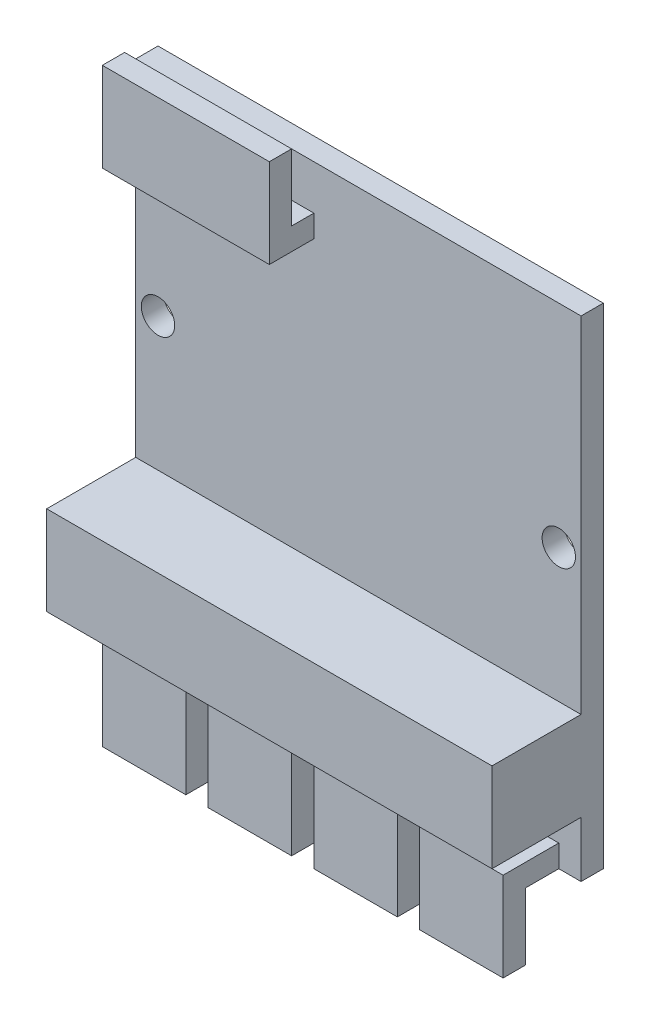
ISO-10303-21;
HEADER;
FILE_DESCRIPTION(('STEP AP214'),'2;1');
FILE_NAME('part.step','',(''),(''),'','','');
FILE_SCHEMA(('AUTOMOTIVE_DESIGN { 1 0 10303 214 1 1 1 1 }'));
ENDSEC;
DATA;
#1=APPLICATION_CONTEXT('core data for automotive mechanical design processes');
#2=APPLICATION_PROTOCOL_DEFINITION('international standard','automotive_design',2000,#1);
#3=PRODUCT_CONTEXT('',#1,'mechanical');
#4=PRODUCT('Part','Part','',(#3));
#5=PRODUCT_RELATED_PRODUCT_CATEGORY('part','',(#4));
#6=PRODUCT_DEFINITION_FORMATION('','',#4);
#7=PRODUCT_DEFINITION_CONTEXT('part definition',#1,'design');
#8=PRODUCT_DEFINITION('design','',#6,#7);
#9=PRODUCT_DEFINITION_SHAPE('','',#8);
#10=(LENGTH_UNIT() NAMED_UNIT(*) SI_UNIT(.MILLI.,.METRE.));
#11=(NAMED_UNIT(*) PLANE_ANGLE_UNIT() SI_UNIT($,.RADIAN.));
#12=(NAMED_UNIT(*) SI_UNIT($,.STERADIAN.) SOLID_ANGLE_UNIT());
#13=UNCERTAINTY_MEASURE_WITH_UNIT(LENGTH_MEASURE(1.E-05),#10,'distance_accuracy_value','');
#14=(GEOMETRIC_REPRESENTATION_CONTEXT(3) GLOBAL_UNCERTAINTY_ASSIGNED_CONTEXT((#13)) GLOBAL_UNIT_ASSIGNED_CONTEXT((#10,
#11,#12)) REPRESENTATION_CONTEXT('',''));
#15=CARTESIAN_POINT('',(0.,0.,0.));
#16=DIRECTION('',(0.,0.,1.));
#17=DIRECTION('',(1.,0.,0.));
#18=AXIS2_PLACEMENT_3D('',#15,#16,#17);
#19=CARTESIAN_POINT('',(-19.,18.,6.));
#20=DIRECTION('',(0.,-1.,0.));
#21=DIRECTION('',(0.,0.,-1.));
#22=AXIS2_PLACEMENT_3D('',#19,#20,#21);
#23=PLANE('',#22);
#24=DIRECTION('',(-1.,0.,0.));
#25=VECTOR('',#24,1.);
#26=CARTESIAN_POINT('',(-19.,18.,4.));
#27=LINE('',#26,#25);
#28=CARTESIAN_POINT('',(-4.00000000000001,18.,4.));
#29=VERTEX_POINT('',#28);
#30=CARTESIAN_POINT('',(-19.,18.,4.));
#31=VERTEX_POINT('',#30);
#32=EDGE_CURVE('E314',#29,#31,#27,.T.);
#33=ORIENTED_EDGE('',*,*,#32,.F.);
#34=DIRECTION('',(0.,0.,-1.));
#35=VECTOR('',#34,1.);
#36=CARTESIAN_POINT('',(-4.00000000000001,18.,6.));
#37=LINE('',#36,#35);
#38=CARTESIAN_POINT('',(-4.00000000000001,18.,2.));
#39=VERTEX_POINT('',#38);
#40=EDGE_CURVE('E350',#29,#39,#37,.T.);
#41=ORIENTED_EDGE('',*,*,#40,.T.);
#42=DIRECTION('',(-1.,0.,0.));
#43=VECTOR('',#42,1.);
#44=CARTESIAN_POINT('',(-19.,18.,2.));
#45=LINE('',#44,#43);
#46=CARTESIAN_POINT('',(-19.,18.,2.));
#47=VERTEX_POINT('',#46);
#48=EDGE_CURVE('E297',#39,#47,#45,.T.);
#49=ORIENTED_EDGE('',*,*,#48,.T.);
#50=DIRECTION('',(0.,0.,-1.));
#51=VECTOR('',#50,1.);
#52=CARTESIAN_POINT('',(-19.,18.,6.));
#53=LINE('',#52,#51);
#54=EDGE_CURVE('E338',#31,#47,#53,.T.);
#55=ORIENTED_EDGE('',*,*,#54,.F.);
#56=EDGE_LOOP('',(#33,#41,#49,#55));
#57=FACE_BOUND('',#56,.T.);
#58=ADVANCED_FACE('F39',(#57),#23,.F.);
#59=CARTESIAN_POINT('',(0.,0.,2.));
#60=DIRECTION('',(0.,0.,-1.));
#61=DIRECTION('',(-1.,0.,0.));
#62=AXIS2_PLACEMENT_3D('',#59,#60,#61);
#63=PLANE('',#62);
#64=CARTESIAN_POINT('',(-18.,3.,2.));
#65=DIRECTION('',(0.,0.,-1.));
#66=DIRECTION('',(-1.,0.,0.));
#67=AXIS2_PLACEMENT_3D('',#64,#65,#66);
#68=CIRCLE('',#67,1.5);
#69=CARTESIAN_POINT('',(-19.5,3.,2.));
#70=VERTEX_POINT('',#69);
#71=EDGE_CURVE('E1127',#70,#70,#68,.T.);
#72=ORIENTED_EDGE('',*,*,#71,.T.);
#73=EDGE_LOOP('',(#72));
#74=FACE_BOUND('',#73,.T.);
#75=CARTESIAN_POINT('',(18.,3.,2.));
#76=DIRECTION('',(0.,0.,1.));
#77=DIRECTION('',(1.,0.,0.));
#78=AXIS2_PLACEMENT_3D('',#75,#76,#77);
#79=CIRCLE('',#78,1.5);
#80=CARTESIAN_POINT('',(19.5,3.,2.));
#81=VERTEX_POINT('',#80);
#82=EDGE_CURVE('E317',#81,#81,#79,.T.);
#83=ORIENTED_EDGE('',*,*,#82,.F.);
#84=EDGE_LOOP('',(#83));
#85=FACE_BOUND('',#84,.T.);
#86=DIRECTION('',(0.,-1.,0.));
#87=VECTOR('',#86,1.);
#88=CARTESIAN_POINT('',(-20.,-22.,2.));
#89=LINE('',#88,#87);
#90=CARTESIAN_POINT('',(-20.,22.,2.));
#91=VERTEX_POINT('',#90);
#92=CARTESIAN_POINT('',(-20.,-9.,2.));
#93=VERTEX_POINT('',#92);
#94=EDGE_CURVE('E610',#91,#93,#89,.T.);
#95=ORIENTED_EDGE('',*,*,#94,.T.);
#96=DIRECTION('',(1.,0.,0.));
#97=VECTOR('',#96,1.);
#98=CARTESIAN_POINT('',(-20.,-9.,2.));
#99=LINE('',#98,#97);
#100=CARTESIAN_POINT('',(20.,-9.,2.));
#101=VERTEX_POINT('',#100);
#102=EDGE_CURVE('E569',#93,#101,#99,.T.);
#103=ORIENTED_EDGE('',*,*,#102,.T.);
#104=DIRECTION('',(0.,1.,0.));
#105=VECTOR('',#104,1.);
#106=CARTESIAN_POINT('',(20.,-22.,2.));
#107=LINE('',#106,#105);
#108=CARTESIAN_POINT('',(20.,22.,2.));
#109=VERTEX_POINT('',#108);
#110=EDGE_CURVE('E606',#101,#109,#107,.T.);
#111=ORIENTED_EDGE('',*,*,#110,.T.);
#112=DIRECTION('',(-1.,0.,0.));
#113=VECTOR('',#112,1.);
#114=CARTESIAN_POINT('',(-20.,22.,2.));
#115=LINE('',#114,#113);
#116=EDGE_CURVE('E605',#109,#91,#115,.T.);
#117=ORIENTED_EDGE('',*,*,#116,.T.);
#118=EDGE_LOOP('',(#95,#103,#111,#117));
#119=FACE_BOUND('',#118,.T.);
#120=DIRECTION('',(0.,-1.,0.));
#121=VECTOR('',#120,1.);
#122=CARTESIAN_POINT('',(-19.,18.,2.));
#123=LINE('',#122,#121);
#124=CARTESIAN_POINT('',(-19.,16.,2.));
#125=VERTEX_POINT('',#124);
#126=EDGE_CURVE('E332',#47,#125,#123,.T.);
#127=ORIENTED_EDGE('',*,*,#126,.F.);
#128=ORIENTED_EDGE('',*,*,#48,.F.);
#129=DIRECTION('',(0.,1.,0.));
#130=VECTOR('',#129,1.);
#131=CARTESIAN_POINT('',(-4.00000000000001,18.,2.));
#132=LINE('',#131,#130);
#133=CARTESIAN_POINT('',(-4.00000000000001,16.,2.));
#134=VERTEX_POINT('',#133);
#135=EDGE_CURVE('E60',#134,#39,#132,.T.);
#136=ORIENTED_EDGE('',*,*,#135,.F.);
#137=DIRECTION('',(1.,0.,0.));
#138=VECTOR('',#137,1.);
#139=CARTESIAN_POINT('',(-19.,16.,2.));
#140=LINE('',#139,#138);
#141=EDGE_CURVE('E55',#125,#134,#140,.T.);
#142=ORIENTED_EDGE('',*,*,#141,.F.);
#143=EDGE_LOOP('',(#127,#128,#136,#142));
#144=FACE_BOUND('',#143,.T.);
#145=ADVANCED_FACE('F800',(#74,#85,#119,#144),#63,.F.);
#146=CARTESIAN_POINT('',(-18.,-20.,7.));
#147=DIRECTION('',(0.,-1.,0.));
#148=DIRECTION('',(0.,0.,-1.));
#149=AXIS2_PLACEMENT_3D('',#146,#147,#148);
#150=PLANE('',#149);
#151=DIRECTION('',(-1.,0.,0.));
#152=VECTOR('',#151,1.);
#153=CARTESIAN_POINT('',(-18.,-20.,2.));
#154=LINE('',#153,#152);
#155=CARTESIAN_POINT('',(-1.,-20.,2.));
#156=VERTEX_POINT('',#155);
#157=CARTESIAN_POINT('',(-8.5,-20.,2.));
#158=VERTEX_POINT('',#157);
#159=EDGE_CURVE('E679',#156,#158,#154,.T.);
#160=ORIENTED_EDGE('',*,*,#159,.T.);
#161=DIRECTION('',(0.,0.,-1.));
#162=VECTOR('',#161,1.);
#163=CARTESIAN_POINT('',(-8.5,-20.,7.));
#164=LINE('',#163,#162);
#165=CARTESIAN_POINT('',(-8.5,-20.,7.));
#166=VERTEX_POINT('',#165);
#167=EDGE_CURVE('E367',#166,#158,#164,.T.);
#168=ORIENTED_EDGE('',*,*,#167,.F.);
#169=DIRECTION('',(-1.,0.,0.));
#170=VECTOR('',#169,1.);
#171=CARTESIAN_POINT('',(-18.,-20.,7.));
#172=LINE('',#171,#170);
#173=CARTESIAN_POINT('',(-1.,-20.,7.));
#174=VERTEX_POINT('',#173);
#175=EDGE_CURVE('E673',#174,#166,#172,.T.);
#176=ORIENTED_EDGE('',*,*,#175,.F.);
#177=DIRECTION('',(0.,0.,1.));
#178=VECTOR('',#177,1.);
#179=CARTESIAN_POINT('',(-1.,-20.,7.));
#180=LINE('',#179,#178);
#181=EDGE_CURVE('E416',#156,#174,#180,.T.);
#182=ORIENTED_EDGE('',*,*,#181,.F.);
#183=EDGE_LOOP('',(#160,#168,#176,#182));
#184=FACE_BOUND('',#183,.T.);
#185=ADVANCED_FACE('F772',(#184),#150,.F.);
#186=CARTESIAN_POINT('',(8.5,-20.,2.));
#187=VERTEX_POINT('',#186);
#188=CARTESIAN_POINT('',(1.,-20.,2.));
#189=VERTEX_POINT('',#188);
#190=EDGE_CURVE('E549',#187,#189,#154,.T.);
#191=ORIENTED_EDGE('',*,*,#190,.T.);
#192=DIRECTION('',(0.,0.,-1.));
#193=VECTOR('',#192,1.);
#194=CARTESIAN_POINT('',(0.999999999999999,-20.,7.));
#195=LINE('',#194,#193);
#196=CARTESIAN_POINT('',(0.999999999999999,-20.,7.));
#197=VERTEX_POINT('',#196);
#198=EDGE_CURVE('E412',#197,#189,#195,.T.);
#199=ORIENTED_EDGE('',*,*,#198,.F.);
#200=CARTESIAN_POINT('',(8.5,-20.,7.));
#201=VERTEX_POINT('',#200);
#202=EDGE_CURVE('E537',#201,#197,#172,.T.);
#203=ORIENTED_EDGE('',*,*,#202,.F.);
#204=DIRECTION('',(0.,0.,1.));
#205=VECTOR('',#204,1.);
#206=CARTESIAN_POINT('',(8.5,-20.,7.));
#207=LINE('',#206,#205);
#208=EDGE_CURVE('E457',#187,#201,#207,.T.);
#209=ORIENTED_EDGE('',*,*,#208,.F.);
#210=EDGE_LOOP('',(#191,#199,#203,#209));
#211=FACE_BOUND('',#210,.T.);
#212=ADVANCED_FACE('F746',(#211),#150,.F.);
#213=CARTESIAN_POINT('',(18.,-20.,2.));
#214=VERTEX_POINT('',#213);
#215=CARTESIAN_POINT('',(10.5,-20.,2.));
#216=VERTEX_POINT('',#215);
#217=EDGE_CURVE('E528',#214,#216,#154,.T.);
#218=ORIENTED_EDGE('',*,*,#217,.T.);
#219=DIRECTION('',(0.,0.,-1.));
#220=VECTOR('',#219,1.);
#221=CARTESIAN_POINT('',(10.5,-20.,7.));
#222=LINE('',#221,#220);
#223=CARTESIAN_POINT('',(10.5,-20.,7.));
#224=VERTEX_POINT('',#223);
#225=EDGE_CURVE('E453',#224,#216,#222,.T.);
#226=ORIENTED_EDGE('',*,*,#225,.F.);
#227=CARTESIAN_POINT('',(18.,-20.,7.));
#228=VERTEX_POINT('',#227);
#229=EDGE_CURVE('E532',#228,#224,#172,.T.);
#230=ORIENTED_EDGE('',*,*,#229,.F.);
#231=DIRECTION('',(0.,0.,-1.));
#232=VECTOR('',#231,1.);
#233=CARTESIAN_POINT('',(18.,-20.,7.));
#234=LINE('',#233,#232);
#235=EDGE_CURVE('E553',#228,#214,#234,.T.);
#236=ORIENTED_EDGE('',*,*,#235,.T.);
#237=EDGE_LOOP('',(#218,#226,#230,#236));
#238=FACE_BOUND('',#237,.T.);
#239=ADVANCED_FACE('F722',(#238),#150,.F.);
#240=CARTESIAN_POINT('',(0.,0.,7.));
#241=DIRECTION('',(0.,0.,-1.));
#242=DIRECTION('',(-1.,0.,0.));
#243=AXIS2_PLACEMENT_3D('',#240,#241,#242);
#244=PLANE('',#243);
#245=ORIENTED_EDGE('',*,*,#175,.T.);
#246=DIRECTION('',(0.,-1.,0.));
#247=VECTOR('',#246,1.);
#248=CARTESIAN_POINT('',(-8.5,22.001,7.));
#249=LINE('',#248,#247);
#250=CARTESIAN_POINT('',(-8.5,-28.,7.));
#251=VERTEX_POINT('',#250);
#252=EDGE_CURVE('E392',#166,#251,#249,.T.);
#253=ORIENTED_EDGE('',*,*,#252,.T.);
#254=DIRECTION('',(-1.,0.,0.));
#255=VECTOR('',#254,1.);
#256=CARTESIAN_POINT('',(-18.,-28.,7.));
#257=LINE('',#256,#255);
#258=CARTESIAN_POINT('',(-1.,-28.,7.));
#259=VERTEX_POINT('',#258);
#260=EDGE_CURVE('E685',#259,#251,#257,.T.);
#261=ORIENTED_EDGE('',*,*,#260,.F.);
#262=DIRECTION('',(0.,-1.,0.));
#263=VECTOR('',#262,1.);
#264=CARTESIAN_POINT('',(-1.,22.001,7.));
#265=LINE('',#264,#263);
#266=EDGE_CURVE('E433',#174,#259,#265,.T.);
#267=ORIENTED_EDGE('',*,*,#266,.F.);
#268=EDGE_LOOP('',(#245,#253,#261,#267));
#269=FACE_BOUND('',#268,.T.);
#270=ADVANCED_FACE('F768',(#269),#244,.F.);
#271=ORIENTED_EDGE('',*,*,#202,.T.);
#272=DIRECTION('',(0.,-1.,0.));
#273=VECTOR('',#272,1.);
#274=CARTESIAN_POINT('',(0.999999999999999,22.001,7.));
#275=LINE('',#274,#273);
#276=CARTESIAN_POINT('',(0.999999999999999,-28.,7.));
#277=VERTEX_POINT('',#276);
#278=EDGE_CURVE('E436',#197,#277,#275,.T.);
#279=ORIENTED_EDGE('',*,*,#278,.T.);
#280=CARTESIAN_POINT('',(8.5,-28.,7.));
#281=VERTEX_POINT('',#280);
#282=EDGE_CURVE('E510',#281,#277,#257,.T.);
#283=ORIENTED_EDGE('',*,*,#282,.F.);
#284=DIRECTION('',(0.,-1.,0.));
#285=VECTOR('',#284,1.);
#286=CARTESIAN_POINT('',(8.5,22.001,7.));
#287=LINE('',#286,#285);
#288=EDGE_CURVE('E474',#201,#281,#287,.T.);
#289=ORIENTED_EDGE('',*,*,#288,.F.);
#290=EDGE_LOOP('',(#271,#279,#283,#289));
#291=FACE_BOUND('',#290,.T.);
#292=ADVANCED_FACE('F742',(#291),#244,.F.);
#293=ORIENTED_EDGE('',*,*,#229,.T.);
#294=DIRECTION('',(0.,-1.,0.));
#295=VECTOR('',#294,1.);
#296=CARTESIAN_POINT('',(10.5,22.001,7.));
#297=LINE('',#296,#295);
#298=CARTESIAN_POINT('',(10.5,-28.,7.));
#299=VERTEX_POINT('',#298);
#300=EDGE_CURVE('E477',#224,#299,#297,.T.);
#301=ORIENTED_EDGE('',*,*,#300,.T.);
#302=CARTESIAN_POINT('',(18.,-28.,7.));
#303=VERTEX_POINT('',#302);
#304=EDGE_CURVE('E505',#303,#299,#257,.T.);
#305=ORIENTED_EDGE('',*,*,#304,.F.);
#306=DIRECTION('',(0.,1.,0.));
#307=VECTOR('',#306,1.);
#308=CARTESIAN_POINT('',(18.,-22.,7.));
#309=LINE('',#308,#307);
#310=EDGE_CURVE('E527',#303,#228,#309,.T.);
#311=ORIENTED_EDGE('',*,*,#310,.T.);
#312=EDGE_LOOP('',(#293,#301,#305,#311));
#313=FACE_BOUND('',#312,.T.);
#314=ADVANCED_FACE('F716',(#313),#244,.F.);
#315=CARTESIAN_POINT('',(-18.,-28.,5.));
#316=DIRECTION('',(0.,0.,1.));
#317=DIRECTION('',(1.,0.,0.));
#318=AXIS2_PLACEMENT_3D('',#315,#316,#317);
#319=PLANE('',#318);
#320=DIRECTION('',(1.,0.,0.));
#321=VECTOR('',#320,1.);
#322=CARTESIAN_POINT('',(-18.,-28.,5.));
#323=LINE('',#322,#321);
#324=CARTESIAN_POINT('',(-8.5,-28.,5.));
#325=VERTEX_POINT('',#324);
#326=CARTESIAN_POINT('',(-1.,-28.,5.));
#327=VERTEX_POINT('',#326);
#328=EDGE_CURVE('E500',#325,#327,#323,.T.);
#329=ORIENTED_EDGE('',*,*,#328,.F.);
#330=DIRECTION('',(0.,-1.,0.));
#331=VECTOR('',#330,1.);
#332=CARTESIAN_POINT('',(-8.5,22.001,5.));
#333=LINE('',#332,#331);
#334=CARTESIAN_POINT('',(-8.5,-22.,5.));
#335=VERTEX_POINT('',#334);
#336=EDGE_CURVE('E360',#335,#325,#333,.T.);
#337=ORIENTED_EDGE('',*,*,#336,.F.);
#338=DIRECTION('',(1.,0.,0.));
#339=VECTOR('',#338,1.);
#340=CARTESIAN_POINT('',(-18.,-22.,5.));
#341=LINE('',#340,#339);
#342=CARTESIAN_POINT('',(-1.,-22.,5.));
#343=VERTEX_POINT('',#342);
#344=EDGE_CURVE('E514',#335,#343,#341,.T.);
#345=ORIENTED_EDGE('',*,*,#344,.T.);
#346=DIRECTION('',(0.,1.,0.));
#347=VECTOR('',#346,1.);
#348=CARTESIAN_POINT('',(-1.,22.001,5.));
#349=LINE('',#348,#347);
#350=EDGE_CURVE('E408',#327,#343,#349,.T.);
#351=ORIENTED_EDGE('',*,*,#350,.F.);
#352=EDGE_LOOP('',(#329,#337,#345,#351));
#353=FACE_BOUND('',#352,.T.);
#354=ADVANCED_FACE('F758',(#353),#319,.F.);
#355=CARTESIAN_POINT('',(1.,-28.,5.));
#356=VERTEX_POINT('',#355);
#357=CARTESIAN_POINT('',(8.5,-28.,5.));
#358=VERTEX_POINT('',#357);
#359=EDGE_CURVE('E691',#356,#358,#323,.T.);
#360=ORIENTED_EDGE('',*,*,#359,.F.);
#361=DIRECTION('',(0.,-1.,0.));
#362=VECTOR('',#361,1.);
#363=CARTESIAN_POINT('',(1.,22.001,5.));
#364=LINE('',#363,#362);
#365=CARTESIAN_POINT('',(1.,-22.,5.));
#366=VERTEX_POINT('',#365);
#367=EDGE_CURVE('E405',#366,#356,#364,.T.);
#368=ORIENTED_EDGE('',*,*,#367,.F.);
#369=CARTESIAN_POINT('',(8.5,-22.,5.));
#370=VERTEX_POINT('',#369);
#371=EDGE_CURVE('E697',#366,#370,#341,.T.);
#372=ORIENTED_EDGE('',*,*,#371,.T.);
#373=DIRECTION('',(0.,1.,0.));
#374=VECTOR('',#373,1.);
#375=CARTESIAN_POINT('',(8.5,22.001,5.));
#376=LINE('',#375,#374);
#377=EDGE_CURVE('E450',#358,#370,#376,.T.);
#378=ORIENTED_EDGE('',*,*,#377,.F.);
#379=EDGE_LOOP('',(#360,#368,#372,#378));
#380=FACE_BOUND('',#379,.T.);
#381=ADVANCED_FACE('F732',(#380),#319,.F.);
#382=CARTESIAN_POINT('',(10.5,-28.,5.));
#383=VERTEX_POINT('',#382);
#384=CARTESIAN_POINT('',(18.,-28.,5.));
#385=VERTEX_POINT('',#384);
#386=EDGE_CURVE('E493',#383,#385,#323,.T.);
#387=ORIENTED_EDGE('',*,*,#386,.F.);
#388=DIRECTION('',(0.,-1.,0.));
#389=VECTOR('',#388,1.);
#390=CARTESIAN_POINT('',(10.5,22.001,5.));
#391=LINE('',#390,#389);
#392=CARTESIAN_POINT('',(10.5,-22.,5.));
#393=VERTEX_POINT('',#392);
#394=EDGE_CURVE('E359',#393,#383,#391,.T.);
#395=ORIENTED_EDGE('',*,*,#394,.F.);
#396=CARTESIAN_POINT('',(18.,-22.,5.));
#397=VERTEX_POINT('',#396);
#398=EDGE_CURVE('E404',#393,#397,#341,.T.);
#399=ORIENTED_EDGE('',*,*,#398,.T.);
#400=DIRECTION('',(0.,1.,0.));
#401=VECTOR('',#400,1.);
#402=CARTESIAN_POINT('',(18.,-28.,5.));
#403=LINE('',#402,#401);
#404=EDGE_CURVE('E509',#385,#397,#403,.T.);
#405=ORIENTED_EDGE('',*,*,#404,.F.);
#406=EDGE_LOOP('',(#387,#395,#399,#405));
#407=FACE_BOUND('',#406,.T.);
#408=ADVANCED_FACE('F705',(#407),#319,.F.);
#409=CARTESIAN_POINT('',(0.,-28.,0.));
#410=DIRECTION('',(0.,-1.,0.));
#411=DIRECTION('',(0.,0.,-1.));
#412=AXIS2_PLACEMENT_3D('',#409,#410,#411);
#413=PLANE('',#412);
#414=DIRECTION('',(0.,0.,1.));
#415=VECTOR('',#414,1.);
#416=CARTESIAN_POINT('',(-8.5,-28.,7.));
#417=LINE('',#416,#415);
#418=EDGE_CURVE('E384',#325,#251,#417,.T.);
#419=ORIENTED_EDGE('',*,*,#418,.F.);
#420=ORIENTED_EDGE('',*,*,#328,.T.);
#421=DIRECTION('',(0.,0.,-1.));
#422=VECTOR('',#421,1.);
#423=CARTESIAN_POINT('',(-1.,-28.,7.));
#424=LINE('',#423,#422);
#425=EDGE_CURVE('E426',#259,#327,#424,.T.);
#426=ORIENTED_EDGE('',*,*,#425,.F.);
#427=ORIENTED_EDGE('',*,*,#260,.T.);
#428=EDGE_LOOP('',(#419,#420,#426,#427));
#429=FACE_BOUND('',#428,.T.);
#430=ADVANCED_FACE('F763',(#429),#413,.T.);
#431=DIRECTION('',(0.,0.,1.));
#432=VECTOR('',#431,1.);
#433=CARTESIAN_POINT('',(0.999999999999999,-28.,7.));
#434=LINE('',#433,#432);
#435=EDGE_CURVE('E429',#356,#277,#434,.T.);
#436=ORIENTED_EDGE('',*,*,#435,.F.);
#437=ORIENTED_EDGE('',*,*,#359,.T.);
#438=DIRECTION('',(0.,0.,-1.));
#439=VECTOR('',#438,1.);
#440=CARTESIAN_POINT('',(8.5,-28.,7.));
#441=LINE('',#440,#439);
#442=EDGE_CURVE('E467',#281,#358,#441,.T.);
#443=ORIENTED_EDGE('',*,*,#442,.F.);
#444=ORIENTED_EDGE('',*,*,#282,.T.);
#445=EDGE_LOOP('',(#436,#437,#443,#444));
#446=FACE_BOUND('',#445,.T.);
#447=ADVANCED_FACE('F737',(#446),#413,.T.);
#448=DIRECTION('',(0.,0.,1.));
#449=VECTOR('',#448,1.);
#450=CARTESIAN_POINT('',(10.5,-28.,7.));
#451=LINE('',#450,#449);
#452=EDGE_CURVE('E470',#383,#299,#451,.T.);
#453=ORIENTED_EDGE('',*,*,#452,.F.);
#454=ORIENTED_EDGE('',*,*,#386,.T.);
#455=DIRECTION('',(0.,0.,1.));
#456=VECTOR('',#455,1.);
#457=CARTESIAN_POINT('',(18.,-28.,7.));
#458=LINE('',#457,#456);
#459=EDGE_CURVE('E499',#385,#303,#458,.T.);
#460=ORIENTED_EDGE('',*,*,#459,.T.);
#461=ORIENTED_EDGE('',*,*,#304,.T.);
#462=EDGE_LOOP('',(#453,#454,#460,#461));
#463=FACE_BOUND('',#462,.T.);
#464=ADVANCED_FACE('F714',(#463),#413,.T.);
#465=CARTESIAN_POINT('',(-20.,-22.,2.));
#466=DIRECTION('',(0.,1.,0.));
#467=DIRECTION('',(0.,0.,1.));
#468=AXIS2_PLACEMENT_3D('',#465,#466,#467);
#469=PLANE('',#468);
#470=ORIENTED_EDGE('',*,*,#344,.F.);
#471=DIRECTION('',(0.,0.,1.));
#472=VECTOR('',#471,1.);
#473=CARTESIAN_POINT('',(-8.5,-22.,7.));
#474=LINE('',#473,#472);
#475=CARTESIAN_POINT('',(-8.5,-22.,2.));
#476=VERTEX_POINT('',#475);
#477=EDGE_CURVE('E374',#476,#335,#474,.T.);
#478=ORIENTED_EDGE('',*,*,#477,.F.);
#479=DIRECTION('',(1.,0.,0.));
#480=VECTOR('',#479,1.);
#481=CARTESIAN_POINT('',(-10.5,-22.,2.));
#482=LINE('',#481,#480);
#483=CARTESIAN_POINT('',(-10.5,-22.,2.));
#484=VERTEX_POINT('',#483);
#485=EDGE_CURVE('E391',#484,#476,#482,.T.);
#486=ORIENTED_EDGE('',*,*,#485,.F.);
#487=DIRECTION('',(0.,0.,-1.));
#488=VECTOR('',#487,1.);
#489=CARTESIAN_POINT('',(-10.5,-22.,7.));
#490=LINE('',#489,#488);
#491=CARTESIAN_POINT('',(-10.5,-22.,5.));
#492=VERTEX_POINT('',#491);
#493=EDGE_CURVE('E377',#492,#484,#490,.T.);
#494=ORIENTED_EDGE('',*,*,#493,.F.);
#495=CARTESIAN_POINT('',(-18.,-22.,5.));
#496=VERTEX_POINT('',#495);
#497=EDGE_CURVE('E494',#496,#492,#341,.T.);
#498=ORIENTED_EDGE('',*,*,#497,.F.);
#499=DIRECTION('',(0.,0.,-1.));
#500=VECTOR('',#499,1.);
#501=CARTESIAN_POINT('',(-18.,-22.,7.));
#502=LINE('',#501,#500);
#503=CARTESIAN_POINT('',(-18.,-22.,2.));
#504=VERTEX_POINT('',#503);
#505=EDGE_CURVE('E560',#496,#504,#502,.T.);
#506=ORIENTED_EDGE('',*,*,#505,.T.);
#507=DIRECTION('',(1.,0.,0.));
#508=VECTOR('',#507,1.);
#509=CARTESIAN_POINT('',(-20.,-22.,2.));
#510=LINE('',#509,#508);
#511=CARTESIAN_POINT('',(-20.,-22.,2.));
#512=VERTEX_POINT('',#511);
#513=EDGE_CURVE('E614',#512,#504,#510,.T.);
#514=ORIENTED_EDGE('',*,*,#513,.F.);
#515=DIRECTION('',(0.,0.,-1.));
#516=VECTOR('',#515,1.);
#517=CARTESIAN_POINT('',(-20.,-22.,2.));
#518=LINE('',#517,#516);
#519=CARTESIAN_POINT('',(-20.,-22.,0.));
#520=VERTEX_POINT('',#519);
#521=EDGE_CURVE('E634',#512,#520,#518,.T.);
#522=ORIENTED_EDGE('',*,*,#521,.T.);
#523=DIRECTION('',(1.,0.,0.));
#524=VECTOR('',#523,1.);
#525=CARTESIAN_POINT('',(-20.,-22.,0.));
#526=LINE('',#525,#524);
#527=CARTESIAN_POINT('',(20.,-22.,0.));
#528=VERTEX_POINT('',#527);
#529=EDGE_CURVE('E628',#520,#528,#526,.T.);
#530=ORIENTED_EDGE('',*,*,#529,.T.);
#531=DIRECTION('',(0.,0.,-1.));
#532=VECTOR('',#531,1.);
#533=CARTESIAN_POINT('',(20.,-22.,2.));
#534=LINE('',#533,#532);
#535=CARTESIAN_POINT('',(20.,-22.,2.));
#536=VERTEX_POINT('',#535);
#537=EDGE_CURVE('E618',#536,#528,#534,.T.);
#538=ORIENTED_EDGE('',*,*,#537,.F.);
#539=CARTESIAN_POINT('',(18.,-22.,2.));
#540=VERTEX_POINT('',#539);
#541=EDGE_CURVE('E613',#540,#536,#510,.T.);
#542=ORIENTED_EDGE('',*,*,#541,.F.);
#543=DIRECTION('',(0.,0.,-1.));
#544=VECTOR('',#543,1.);
#545=CARTESIAN_POINT('',(18.,-22.,7.));
#546=LINE('',#545,#544);
#547=EDGE_CURVE('E557',#397,#540,#546,.T.);
#548=ORIENTED_EDGE('',*,*,#547,.F.);
#549=ORIENTED_EDGE('',*,*,#398,.F.);
#550=DIRECTION('',(0.,0.,1.));
#551=VECTOR('',#550,1.);
#552=CARTESIAN_POINT('',(10.5,-22.,7.));
#553=LINE('',#552,#551);
#554=CARTESIAN_POINT('',(10.5,-22.,2.));
#555=VERTEX_POINT('',#554);
#556=EDGE_CURVE('E460',#555,#393,#553,.T.);
#557=ORIENTED_EDGE('',*,*,#556,.F.);
#558=DIRECTION('',(1.,0.,0.));
#559=VECTOR('',#558,1.);
#560=CARTESIAN_POINT('',(8.5,-22.,2.));
#561=LINE('',#560,#559);
#562=CARTESIAN_POINT('',(8.5,-22.,2.));
#563=VERTEX_POINT('',#562);
#564=EDGE_CURVE('E409',#563,#555,#561,.T.);
#565=ORIENTED_EDGE('',*,*,#564,.F.);
#566=DIRECTION('',(0.,0.,-1.));
#567=VECTOR('',#566,1.);
#568=CARTESIAN_POINT('',(8.5,-22.,7.));
#569=LINE('',#568,#567);
#570=EDGE_CURVE('E463',#370,#563,#569,.T.);
#571=ORIENTED_EDGE('',*,*,#570,.F.);
#572=ORIENTED_EDGE('',*,*,#371,.F.);
#573=DIRECTION('',(0.,0.,1.));
#574=VECTOR('',#573,1.);
#575=CARTESIAN_POINT('',(0.999999999999999,-22.,7.));
#576=LINE('',#575,#574);
#577=CARTESIAN_POINT('',(1.,-22.,2.));
#578=VERTEX_POINT('',#577);
#579=EDGE_CURVE('E419',#578,#366,#576,.T.);
#580=ORIENTED_EDGE('',*,*,#579,.F.);
#581=DIRECTION('',(1.,0.,0.));
#582=VECTOR('',#581,1.);
#583=CARTESIAN_POINT('',(-1.,-22.,2.));
#584=LINE('',#583,#582);
#585=CARTESIAN_POINT('',(-1.,-22.,2.));
#586=VERTEX_POINT('',#585);
#587=EDGE_CURVE('E364',#586,#578,#584,.T.);
#588=ORIENTED_EDGE('',*,*,#587,.F.);
#589=DIRECTION('',(0.,0.,-1.));
#590=VECTOR('',#589,1.);
#591=CARTESIAN_POINT('',(-1.,-22.,7.));
#592=LINE('',#591,#590);
#593=EDGE_CURVE('E422',#343,#586,#592,.T.);
#594=ORIENTED_EDGE('',*,*,#593,.F.);
#595=EDGE_LOOP('',(#470,#478,#486,#494,#498,#506,#514,#522,#530,#538,#542,#548,#549,#557,#565,
#571,#572,#580,#588,#594));
#596=FACE_BOUND('',#595,.T.);
#597=ADVANCED_FACE('F654',(#596),#469,.F.);
#598=DIRECTION('',(0.,-1.,0.));
#599=VECTOR('',#598,1.);
#600=CARTESIAN_POINT('',(-18.,-22.,2.));
#601=LINE('',#600,#599);
#602=CARTESIAN_POINT('',(-18.,-20.,2.));
#603=VERTEX_POINT('',#602);
#604=EDGE_CURVE('E522',#603,#504,#601,.T.);
#605=ORIENTED_EDGE('',*,*,#604,.F.);
#606=CARTESIAN_POINT('',(-10.5,-20.,2.));
#607=VERTEX_POINT('',#606);
#608=EDGE_CURVE('E545',#607,#603,#154,.T.);
#609=ORIENTED_EDGE('',*,*,#608,.F.);
#610=DIRECTION('',(0.,-1.,0.));
#611=VECTOR('',#610,1.);
#612=CARTESIAN_POINT('',(-10.5,22.001,2.));
#613=LINE('',#612,#611);
#614=EDGE_CURVE('E387',#607,#484,#613,.T.);
#615=ORIENTED_EDGE('',*,*,#614,.T.);
#616=ORIENTED_EDGE('',*,*,#485,.T.);
#617=DIRECTION('',(0.,-1.,0.));
#618=VECTOR('',#617,1.);
#619=CARTESIAN_POINT('',(-8.5,22.001,2.));
#620=LINE('',#619,#618);
#621=EDGE_CURVE('E396',#158,#476,#620,.T.);
#622=ORIENTED_EDGE('',*,*,#621,.F.);
#623=ORIENTED_EDGE('',*,*,#159,.F.);
#624=DIRECTION('',(0.,-1.,0.));
#625=VECTOR('',#624,1.);
#626=CARTESIAN_POINT('',(-1.,22.001,2.));
#627=LINE('',#626,#625);
#628=EDGE_CURVE('E432',#156,#586,#627,.T.);
#629=ORIENTED_EDGE('',*,*,#628,.T.);
#630=ORIENTED_EDGE('',*,*,#587,.T.);
#631=DIRECTION('',(0.,-1.,0.));
#632=VECTOR('',#631,1.);
#633=CARTESIAN_POINT('',(1.,22.001,2.));
#634=LINE('',#633,#632);
#635=EDGE_CURVE('E440',#189,#578,#634,.T.);
#636=ORIENTED_EDGE('',*,*,#635,.F.);
#637=ORIENTED_EDGE('',*,*,#190,.F.);
#638=DIRECTION('',(0.,-1.,0.));
#639=VECTOR('',#638,1.);
#640=CARTESIAN_POINT('',(8.5,22.001,2.));
#641=LINE('',#640,#639);
#642=EDGE_CURVE('E473',#187,#563,#641,.T.);
#643=ORIENTED_EDGE('',*,*,#642,.T.);
#644=ORIENTED_EDGE('',*,*,#564,.T.);
#645=DIRECTION('',(0.,-1.,0.));
#646=VECTOR('',#645,1.);
#647=CARTESIAN_POINT('',(10.5,22.001,2.));
#648=LINE('',#647,#646);
#649=EDGE_CURVE('E481',#216,#555,#648,.T.);
#650=ORIENTED_EDGE('',*,*,#649,.F.);
#651=ORIENTED_EDGE('',*,*,#217,.F.);
#652=DIRECTION('',(0.,1.,0.));
#653=VECTOR('',#652,1.);
#654=CARTESIAN_POINT('',(18.,-22.,2.));
#655=LINE('',#654,#653);
#656=EDGE_CURVE('E541',#540,#214,#655,.T.);
#657=ORIENTED_EDGE('',*,*,#656,.F.);
#658=ORIENTED_EDGE('',*,*,#541,.T.);
#659=CARTESIAN_POINT('',(20.,-17.,2.));
#660=VERTEX_POINT('',#659);
#661=EDGE_CURVE('E602',#536,#660,#107,.T.);
#662=ORIENTED_EDGE('',*,*,#661,.T.);
#663=DIRECTION('',(1.,0.,0.));
#664=VECTOR('',#663,1.);
#665=CARTESIAN_POINT('',(-20.,-17.,2.));
#666=LINE('',#665,#664);
#667=CARTESIAN_POINT('',(-20.,-17.,2.));
#668=VERTEX_POINT('',#667);
#669=EDGE_CURVE('E563',#668,#660,#666,.T.);
#670=ORIENTED_EDGE('',*,*,#669,.F.);
#671=EDGE_CURVE('E609',#668,#512,#89,.T.);
#672=ORIENTED_EDGE('',*,*,#671,.T.);
#673=ORIENTED_EDGE('',*,*,#513,.T.);
#674=EDGE_LOOP('',(#605,#609,#615,#616,#622,#623,#629,#630,#636,#637,#643,#644,#650,#651,#657,
#658,#662,#670,#672,#673));
#675=FACE_BOUND('',#674,.T.);
#676=ADVANCED_FACE('F663',(#675),#63,.F.);
#677=CARTESIAN_POINT('',(20.,-22.,2.));
#678=DIRECTION('',(-1.,0.,0.));
#679=DIRECTION('',(0.,0.,1.));
#680=AXIS2_PLACEMENT_3D('',#677,#678,#679);
#681=PLANE('',#680);
#682=DIRECTION('',(0.,1.,0.));
#683=VECTOR('',#682,1.);
#684=CARTESIAN_POINT('',(20.,-22.,0.));
#685=LINE('',#684,#683);
#686=CARTESIAN_POINT('',(20.,22.,0.));
#687=VERTEX_POINT('',#686);
#688=EDGE_CURVE('E601',#528,#687,#685,.T.);
#689=ORIENTED_EDGE('',*,*,#688,.T.);
#690=DIRECTION('',(0.,0.,-1.));
#691=VECTOR('',#690,1.);
#692=CARTESIAN_POINT('',(20.,22.,2.));
#693=LINE('',#692,#691);
#694=EDGE_CURVE('E11',#109,#687,#693,.T.);
#695=ORIENTED_EDGE('',*,*,#694,.F.);
#696=ORIENTED_EDGE('',*,*,#110,.F.);
#697=DIRECTION('',(0.,0.,-1.));
#698=VECTOR('',#697,1.);
#699=CARTESIAN_POINT('',(20.,-9.,10.));
#700=LINE('',#699,#698);
#701=CARTESIAN_POINT('',(20.,-9.,10.));
#702=VERTEX_POINT('',#701);
#703=EDGE_CURVE('E589',#702,#101,#700,.T.);
#704=ORIENTED_EDGE('',*,*,#703,.F.);
#705=DIRECTION('',(0.,-1.,0.));
#706=VECTOR('',#705,1.);
#707=CARTESIAN_POINT('',(20.,-9.,10.));
#708=LINE('',#707,#706);
#709=CARTESIAN_POINT('',(20.,-17.,10.));
#710=VERTEX_POINT('',#709);
#711=EDGE_CURVE('E572',#702,#710,#708,.T.);
#712=ORIENTED_EDGE('',*,*,#711,.T.);
#713=DIRECTION('',(0.,0.,-1.));
#714=VECTOR('',#713,1.);
#715=CARTESIAN_POINT('',(20.,-17.,10.));
#716=LINE('',#715,#714);
#717=EDGE_CURVE('E593',#710,#660,#716,.T.);
#718=ORIENTED_EDGE('',*,*,#717,.T.);
#719=ORIENTED_EDGE('',*,*,#661,.F.);
#720=ORIENTED_EDGE('',*,*,#537,.T.);
#721=EDGE_LOOP('',(#689,#695,#696,#704,#712,#718,#719,#720));
#722=FACE_BOUND('',#721,.T.);
#723=ADVANCED_FACE('F41',(#722),#681,.F.);
#724=CARTESIAN_POINT('',(-20.,22.,2.));
#725=DIRECTION('',(0.,-1.,0.));
#726=DIRECTION('',(0.,0.,-1.));
#727=AXIS2_PLACEMENT_3D('',#724,#725,#726);
#728=PLANE('',#727);
#729=DIRECTION('',(-1.,0.,0.));
#730=VECTOR('',#729,1.);
#731=CARTESIAN_POINT('',(-20.,22.,0.));
#732=LINE('',#731,#730);
#733=CARTESIAN_POINT('',(-20.,22.,0.));
#734=VERTEX_POINT('',#733);
#735=EDGE_CURVE('E622',#687,#734,#732,.T.);
#736=ORIENTED_EDGE('',*,*,#735,.T.);
#737=DIRECTION('',(0.,0.,-1.));
#738=VECTOR('',#737,1.);
#739=CARTESIAN_POINT('',(-20.,22.,2.));
#740=LINE('',#739,#738);
#741=EDGE_CURVE('E48',#91,#734,#740,.T.);
#742=ORIENTED_EDGE('',*,*,#741,.F.);
#743=ORIENTED_EDGE('',*,*,#116,.F.);
#744=ORIENTED_EDGE('',*,*,#694,.T.);
#745=EDGE_LOOP('',(#736,#742,#743,#744));
#746=FACE_BOUND('',#745,.T.);
#747=ADVANCED_FACE('F801',(#746),#728,.F.);
#748=CARTESIAN_POINT('',(-20.,-22.,2.));
#749=DIRECTION('',(1.,0.,0.));
#750=DIRECTION('',(0.,0.,-1.));
#751=AXIS2_PLACEMENT_3D('',#748,#749,#750);
#752=PLANE('',#751);
#753=DIRECTION('',(0.,-1.,0.));
#754=VECTOR('',#753,1.);
#755=CARTESIAN_POINT('',(-20.,-22.,0.));
#756=LINE('',#755,#754);
#757=EDGE_CURVE('E625',#734,#520,#756,.T.);
#758=ORIENTED_EDGE('',*,*,#757,.T.);
#759=ORIENTED_EDGE('',*,*,#521,.F.);
#760=ORIENTED_EDGE('',*,*,#671,.F.);
#761=DIRECTION('',(0.,0.,-1.));
#762=VECTOR('',#761,1.);
#763=CARTESIAN_POINT('',(-20.,-17.,10.));
#764=LINE('',#763,#762);
#765=CARTESIAN_POINT('',(-20.,-17.,10.));
#766=VERTEX_POINT('',#765);
#767=EDGE_CURVE('E597',#766,#668,#764,.T.);
#768=ORIENTED_EDGE('',*,*,#767,.F.);
#769=DIRECTION('',(0.,-1.,0.));
#770=VECTOR('',#769,1.);
#771=CARTESIAN_POINT('',(-20.,-9.,10.));
#772=LINE('',#771,#770);
#773=CARTESIAN_POINT('',(-20.,-9.,10.));
#774=VERTEX_POINT('',#773);
#775=EDGE_CURVE('E564',#774,#766,#772,.T.);
#776=ORIENTED_EDGE('',*,*,#775,.F.);
#777=DIRECTION('',(0.,0.,-1.));
#778=VECTOR('',#777,1.);
#779=CARTESIAN_POINT('',(-20.,-9.,10.));
#780=LINE('',#779,#778);
#781=EDGE_CURVE('E580',#774,#93,#780,.T.);
#782=ORIENTED_EDGE('',*,*,#781,.T.);
#783=ORIENTED_EDGE('',*,*,#94,.F.);
#784=ORIENTED_EDGE('',*,*,#741,.T.);
#785=EDGE_LOOP('',(#758,#759,#760,#768,#776,#782,#783,#784));
#786=FACE_BOUND('',#785,.T.);
#787=ADVANCED_FACE('F643',(#786),#752,.F.);
#788=CARTESIAN_POINT('',(0.,0.,0.));
#789=DIRECTION('',(0.,0.,-1.));
#790=DIRECTION('',(-1.,0.,0.));
#791=AXIS2_PLACEMENT_3D('',#788,#789,#790);
#792=PLANE('',#791);
#793=CARTESIAN_POINT('',(-18.,3.,0.));
#794=DIRECTION('',(0.,0.,-1.));
#795=DIRECTION('',(-1.,0.,0.));
#796=AXIS2_PLACEMENT_3D('',#793,#794,#795);
#797=CIRCLE('',#796,1.5);
#798=CARTESIAN_POINT('',(-19.5,3.,0.));
#799=VERTEX_POINT('',#798);
#800=EDGE_CURVE('E1124',#799,#799,#797,.T.);
#801=ORIENTED_EDGE('',*,*,#800,.F.);
#802=EDGE_LOOP('',(#801));
#803=FACE_BOUND('',#802,.T.);
#804=CARTESIAN_POINT('',(18.,3.,0.));
#805=DIRECTION('',(0.,0.,-1.));
#806=DIRECTION('',(-1.,0.,0.));
#807=AXIS2_PLACEMENT_3D('',#804,#805,#806);
#808=CIRCLE('',#807,1.5);
#809=CARTESIAN_POINT('',(16.5,3.,0.));
#810=VERTEX_POINT('',#809);
#811=EDGE_CURVE('E320',#810,#810,#808,.F.);
#812=ORIENTED_EDGE('',*,*,#811,.T.);
#813=EDGE_LOOP('',(#812));
#814=FACE_BOUND('',#813,.T.);
#815=ORIENTED_EDGE('',*,*,#688,.F.);
#816=ORIENTED_EDGE('',*,*,#529,.F.);
#817=ORIENTED_EDGE('',*,*,#757,.F.);
#818=ORIENTED_EDGE('',*,*,#735,.F.);
#819=EDGE_LOOP('',(#815,#816,#817,#818));
#820=FACE_BOUND('',#819,.T.);
#821=ADVANCED_FACE('F650',(#803,#814,#820),#792,.T.);
#822=CARTESIAN_POINT('',(-20.,-17.,10.));
#823=DIRECTION('',(0.,1.,0.));
#824=DIRECTION('',(0.,0.,1.));
#825=AXIS2_PLACEMENT_3D('',#822,#823,#824);
#826=PLANE('',#825);
#827=ORIENTED_EDGE('',*,*,#669,.T.);
#828=ORIENTED_EDGE('',*,*,#717,.F.);
#829=DIRECTION('',(1.,0.,0.));
#830=VECTOR('',#829,1.);
#831=CARTESIAN_POINT('',(-20.,-17.,10.));
#832=LINE('',#831,#830);
#833=EDGE_CURVE('E568',#766,#710,#832,.T.);
#834=ORIENTED_EDGE('',*,*,#833,.F.);
#835=ORIENTED_EDGE('',*,*,#767,.T.);
#836=EDGE_LOOP('',(#827,#828,#834,#835));
#837=FACE_BOUND('',#836,.T.);
#838=ADVANCED_FACE('F790',(#837),#826,.F.);
#839=CARTESIAN_POINT('',(-20.,-9.,10.));
#840=DIRECTION('',(0.,1.,0.));
#841=DIRECTION('',(0.,0.,1.));
#842=AXIS2_PLACEMENT_3D('',#839,#840,#841);
#843=PLANE('',#842);
#844=ORIENTED_EDGE('',*,*,#102,.F.);
#845=ORIENTED_EDGE('',*,*,#781,.F.);
#846=DIRECTION('',(1.,0.,0.));
#847=VECTOR('',#846,1.);
#848=CARTESIAN_POINT('',(-20.,-9.,10.));
#849=LINE('',#848,#847);
#850=EDGE_CURVE('E576',#774,#702,#849,.T.);
#851=ORIENTED_EDGE('',*,*,#850,.T.);
#852=ORIENTED_EDGE('',*,*,#703,.T.);
#853=EDGE_LOOP('',(#844,#845,#851,#852));
#854=FACE_BOUND('',#853,.T.);
#855=ADVANCED_FACE('F797',(#854),#843,.T.);
#856=CARTESIAN_POINT('',(0.,0.,10.));
#857=DIRECTION('',(0.,0.,1.));
#858=DIRECTION('',(1.,0.,0.));
#859=AXIS2_PLACEMENT_3D('',#856,#857,#858);
#860=PLANE('',#859);
#861=ORIENTED_EDGE('',*,*,#775,.T.);
#862=ORIENTED_EDGE('',*,*,#833,.T.);
#863=ORIENTED_EDGE('',*,*,#711,.F.);
#864=ORIENTED_EDGE('',*,*,#850,.F.);
#865=EDGE_LOOP('',(#861,#862,#863,#864));
#866=FACE_BOUND('',#865,.T.);
#867=ADVANCED_FACE('F794',(#866),#860,.T.);
#868=CARTESIAN_POINT('',(-18.,-22.,7.));
#869=DIRECTION('',(1.,0.,0.));
#870=DIRECTION('',(0.,0.,-1.));
#871=AXIS2_PLACEMENT_3D('',#868,#869,#870);
#872=PLANE('',#871);
#873=ORIENTED_EDGE('',*,*,#604,.T.);
#874=ORIENTED_EDGE('',*,*,#505,.F.);
#875=DIRECTION('',(0.,1.,0.));
#876=VECTOR('',#875,1.);
#877=CARTESIAN_POINT('',(-18.,-28.,5.));
#878=LINE('',#877,#876);
#879=CARTESIAN_POINT('',(-18.,-28.,5.));
#880=VERTEX_POINT('',#879);
#881=EDGE_CURVE('E518',#880,#496,#878,.T.);
#882=ORIENTED_EDGE('',*,*,#881,.F.);
#883=DIRECTION('',(0.,0.,-1.));
#884=VECTOR('',#883,1.);
#885=CARTESIAN_POINT('',(-18.,-28.,7.));
#886=LINE('',#885,#884);
#887=CARTESIAN_POINT('',(-18.,-28.,7.));
#888=VERTEX_POINT('',#887);
#889=EDGE_CURVE('E489',#888,#880,#886,.T.);
#890=ORIENTED_EDGE('',*,*,#889,.F.);
#891=DIRECTION('',(0.,-1.,0.));
#892=VECTOR('',#891,1.);
#893=CARTESIAN_POINT('',(-18.,-22.,7.));
#894=LINE('',#893,#892);
#895=CARTESIAN_POINT('',(-18.,-20.,7.));
#896=VERTEX_POINT('',#895);
#897=EDGE_CURVE('E523',#896,#888,#894,.T.);
#898=ORIENTED_EDGE('',*,*,#897,.F.);
#899=DIRECTION('',(0.,0.,-1.));
#900=VECTOR('',#899,1.);
#901=CARTESIAN_POINT('',(-18.,-20.,7.));
#902=LINE('',#901,#900);
#903=EDGE_CURVE('E536',#896,#603,#902,.T.);
#904=ORIENTED_EDGE('',*,*,#903,.T.);
#905=EDGE_LOOP('',(#873,#874,#882,#890,#898,#904));
#906=FACE_BOUND('',#905,.T.);
#907=ADVANCED_FACE('F785',(#906),#872,.F.);
#908=CARTESIAN_POINT('',(18.,-22.,7.));
#909=DIRECTION('',(-1.,0.,0.));
#910=DIRECTION('',(0.,0.,1.));
#911=AXIS2_PLACEMENT_3D('',#908,#909,#910);
#912=PLANE('',#911);
#913=ORIENTED_EDGE('',*,*,#656,.T.);
#914=ORIENTED_EDGE('',*,*,#235,.F.);
#915=ORIENTED_EDGE('',*,*,#310,.F.);
#916=ORIENTED_EDGE('',*,*,#459,.F.);
#917=ORIENTED_EDGE('',*,*,#404,.T.);
#918=ORIENTED_EDGE('',*,*,#547,.T.);
#919=EDGE_LOOP('',(#913,#914,#915,#916,#917,#918));
#920=FACE_BOUND('',#919,.T.);
#921=ADVANCED_FACE('F709',(#920),#912,.F.);
#922=CARTESIAN_POINT('',(-10.5,-20.,7.));
#923=VERTEX_POINT('',#922);
#924=EDGE_CURVE('E531',#923,#896,#172,.T.);
#925=ORIENTED_EDGE('',*,*,#924,.F.);
#926=DIRECTION('',(0.,0.,1.));
#927=VECTOR('',#926,1.);
#928=CARTESIAN_POINT('',(-10.5,-20.,7.));
#929=LINE('',#928,#927);
#930=EDGE_CURVE('E371',#607,#923,#929,.T.);
#931=ORIENTED_EDGE('',*,*,#930,.F.);
#932=ORIENTED_EDGE('',*,*,#608,.T.);
#933=ORIENTED_EDGE('',*,*,#903,.F.);
#934=EDGE_LOOP('',(#925,#931,#932,#933));
#935=FACE_BOUND('',#934,.T.);
#936=ADVANCED_FACE('F856',(#935),#150,.F.);
#937=CARTESIAN_POINT('',(-10.5,-28.,7.));
#938=VERTEX_POINT('',#937);
#939=EDGE_CURVE('E504',#938,#888,#257,.T.);
#940=ORIENTED_EDGE('',*,*,#939,.F.);
#941=DIRECTION('',(0.,-1.,0.));
#942=VECTOR('',#941,1.);
#943=CARTESIAN_POINT('',(-10.5,22.001,7.));
#944=LINE('',#943,#942);
#945=EDGE_CURVE('E388',#923,#938,#944,.T.);
#946=ORIENTED_EDGE('',*,*,#945,.F.);
#947=ORIENTED_EDGE('',*,*,#924,.T.);
#948=ORIENTED_EDGE('',*,*,#897,.T.);
#949=EDGE_LOOP('',(#940,#946,#947,#948));
#950=FACE_BOUND('',#949,.T.);
#951=ADVANCED_FACE('F853',(#950),#244,.F.);
#952=ORIENTED_EDGE('',*,*,#497,.T.);
#953=DIRECTION('',(0.,1.,0.));
#954=VECTOR('',#953,1.);
#955=CARTESIAN_POINT('',(-10.5,22.001,5.));
#956=LINE('',#955,#954);
#957=CARTESIAN_POINT('',(-10.5,-28.,5.));
#958=VERTEX_POINT('',#957);
#959=EDGE_CURVE('E363',#958,#492,#956,.T.);
#960=ORIENTED_EDGE('',*,*,#959,.F.);
#961=EDGE_CURVE('E495',#880,#958,#323,.T.);
#962=ORIENTED_EDGE('',*,*,#961,.F.);
#963=ORIENTED_EDGE('',*,*,#881,.T.);
#964=EDGE_LOOP('',(#952,#960,#962,#963));
#965=FACE_BOUND('',#964,.T.);
#966=ADVANCED_FACE('F781',(#965),#319,.F.);
#967=DIRECTION('',(0.,0.,-1.));
#968=VECTOR('',#967,1.);
#969=CARTESIAN_POINT('',(-10.5,-28.,7.));
#970=LINE('',#969,#968);
#971=EDGE_CURVE('E381',#938,#958,#970,.T.);
#972=ORIENTED_EDGE('',*,*,#971,.F.);
#973=ORIENTED_EDGE('',*,*,#939,.T.);
#974=ORIENTED_EDGE('',*,*,#889,.T.);
#975=ORIENTED_EDGE('',*,*,#961,.T.);
#976=EDGE_LOOP('',(#972,#973,#974,#975));
#977=FACE_BOUND('',#976,.T.);
#978=ADVANCED_FACE('F845',(#977),#413,.T.);
#979=CARTESIAN_POINT('',(10.5,22.001,7.));
#980=DIRECTION('',(1.,0.,0.));
#981=DIRECTION('',(0.,0.,-1.));
#982=AXIS2_PLACEMENT_3D('',#979,#980,#981);
#983=PLANE('',#982);
#984=ORIENTED_EDGE('',*,*,#225,.T.);
#985=ORIENTED_EDGE('',*,*,#649,.T.);
#986=ORIENTED_EDGE('',*,*,#556,.T.);
#987=ORIENTED_EDGE('',*,*,#394,.T.);
#988=ORIENTED_EDGE('',*,*,#452,.T.);
#989=ORIENTED_EDGE('',*,*,#300,.F.);
#990=EDGE_LOOP('',(#984,#985,#986,#987,#988,#989));
#991=FACE_BOUND('',#990,.T.);
#992=ADVANCED_FACE('F720',(#991),#983,.F.);
#993=CARTESIAN_POINT('',(8.5,22.001,7.));
#994=DIRECTION('',(-1.,0.,0.));
#995=DIRECTION('',(0.,0.,1.));
#996=AXIS2_PLACEMENT_3D('',#993,#994,#995);
#997=PLANE('',#996);
#998=ORIENTED_EDGE('',*,*,#208,.T.);
#999=ORIENTED_EDGE('',*,*,#288,.T.);
#1000=ORIENTED_EDGE('',*,*,#442,.T.);
#1001=ORIENTED_EDGE('',*,*,#377,.T.);
#1002=ORIENTED_EDGE('',*,*,#570,.T.);
#1003=ORIENTED_EDGE('',*,*,#642,.F.);
#1004=EDGE_LOOP('',(#998,#999,#1000,#1001,#1002,#1003));
#1005=FACE_BOUND('',#1004,.T.);
#1006=ADVANCED_FACE('F840',(#1005),#997,.F.);
#1007=CARTESIAN_POINT('',(0.999999999999999,22.001,7.));
#1008=DIRECTION('',(1.,0.,0.));
#1009=DIRECTION('',(0.,0.,-1.));
#1010=AXIS2_PLACEMENT_3D('',#1007,#1008,#1009);
#1011=PLANE('',#1010);
#1012=ORIENTED_EDGE('',*,*,#198,.T.);
#1013=ORIENTED_EDGE('',*,*,#635,.T.);
#1014=ORIENTED_EDGE('',*,*,#579,.T.);
#1015=ORIENTED_EDGE('',*,*,#367,.T.);
#1016=ORIENTED_EDGE('',*,*,#435,.T.);
#1017=ORIENTED_EDGE('',*,*,#278,.F.);
#1018=EDGE_LOOP('',(#1012,#1013,#1014,#1015,#1016,#1017));
#1019=FACE_BOUND('',#1018,.T.);
#1020=ADVANCED_FACE('F735',(#1019),#1011,.F.);
#1021=CARTESIAN_POINT('',(-1.,22.001,7.));
#1022=DIRECTION('',(-1.,0.,0.));
#1023=DIRECTION('',(0.,0.,1.));
#1024=AXIS2_PLACEMENT_3D('',#1021,#1022,#1023);
#1025=PLANE('',#1024);
#1026=ORIENTED_EDGE('',*,*,#181,.T.);
#1027=ORIENTED_EDGE('',*,*,#266,.T.);
#1028=ORIENTED_EDGE('',*,*,#425,.T.);
#1029=ORIENTED_EDGE('',*,*,#350,.T.);
#1030=ORIENTED_EDGE('',*,*,#593,.T.);
#1031=ORIENTED_EDGE('',*,*,#628,.F.);
#1032=EDGE_LOOP('',(#1026,#1027,#1028,#1029,#1030,#1031));
#1033=FACE_BOUND('',#1032,.T.);
#1034=ADVANCED_FACE('F835',(#1033),#1025,.F.);
#1035=CARTESIAN_POINT('',(-8.5,22.001,7.));
#1036=DIRECTION('',(1.,0.,0.));
#1037=DIRECTION('',(0.,0.,-1.));
#1038=AXIS2_PLACEMENT_3D('',#1035,#1036,#1037);
#1039=PLANE('',#1038);
#1040=ORIENTED_EDGE('',*,*,#167,.T.);
#1041=ORIENTED_EDGE('',*,*,#621,.T.);
#1042=ORIENTED_EDGE('',*,*,#477,.T.);
#1043=ORIENTED_EDGE('',*,*,#336,.T.);
#1044=ORIENTED_EDGE('',*,*,#418,.T.);
#1045=ORIENTED_EDGE('',*,*,#252,.F.);
#1046=EDGE_LOOP('',(#1040,#1041,#1042,#1043,#1044,#1045));
#1047=FACE_BOUND('',#1046,.T.);
#1048=ADVANCED_FACE('F761',(#1047),#1039,.F.);
#1049=CARTESIAN_POINT('',(-10.5,22.001,7.));
#1050=DIRECTION('',(-1.,0.,0.));
#1051=DIRECTION('',(0.,0.,1.));
#1052=AXIS2_PLACEMENT_3D('',#1049,#1050,#1051);
#1053=PLANE('',#1052);
#1054=ORIENTED_EDGE('',*,*,#930,.T.);
#1055=ORIENTED_EDGE('',*,*,#945,.T.);
#1056=ORIENTED_EDGE('',*,*,#971,.T.);
#1057=ORIENTED_EDGE('',*,*,#959,.T.);
#1058=ORIENTED_EDGE('',*,*,#493,.T.);
#1059=ORIENTED_EDGE('',*,*,#614,.F.);
#1060=EDGE_LOOP('',(#1054,#1055,#1056,#1057,#1058,#1059));
#1061=FACE_BOUND('',#1060,.T.);
#1062=ADVANCED_FACE('F832',(#1061),#1053,.F.);
#1063=CARTESIAN_POINT('',(-19.,18.,6.));
#1064=DIRECTION('',(1.,0.,0.));
#1065=DIRECTION('',(0.,0.,-1.));
#1066=AXIS2_PLACEMENT_3D('',#1063,#1064,#1065);
#1067=PLANE('',#1066);
#1068=ORIENTED_EDGE('',*,*,#126,.T.);
#1069=DIRECTION('',(0.,0.,-1.));
#1070=VECTOR('',#1069,1.);
#1071=CARTESIAN_POINT('',(-19.,16.,6.));
#1072=LINE('',#1071,#1070);
#1073=CARTESIAN_POINT('',(-19.,16.,6.));
#1074=VERTEX_POINT('',#1073);
#1075=EDGE_CURVE('E293',#1074,#125,#1072,.T.);
#1076=ORIENTED_EDGE('',*,*,#1075,.F.);
#1077=DIRECTION('',(0.,-1.,0.));
#1078=VECTOR('',#1077,1.);
#1079=CARTESIAN_POINT('',(-19.,18.,6.));
#1080=LINE('',#1079,#1078);
#1081=CARTESIAN_POINT('',(-19.,24.,6.));
#1082=VERTEX_POINT('',#1081);
#1083=EDGE_CURVE('E286',#1082,#1074,#1080,.T.);
#1084=ORIENTED_EDGE('',*,*,#1083,.F.);
#1085=DIRECTION('',(0.,0.,1.));
#1086=VECTOR('',#1085,1.);
#1087=CARTESIAN_POINT('',(-19.,24.,6.));
#1088=LINE('',#1087,#1086);
#1089=CARTESIAN_POINT('',(-19.,24.,4.));
#1090=VERTEX_POINT('',#1089);
#1091=EDGE_CURVE('E292',#1090,#1082,#1088,.T.);
#1092=ORIENTED_EDGE('',*,*,#1091,.F.);
#1093=DIRECTION('',(0.,-1.,0.));
#1094=VECTOR('',#1093,1.);
#1095=CARTESIAN_POINT('',(-19.,24.,4.));
#1096=LINE('',#1095,#1094);
#1097=EDGE_CURVE('E326',#1090,#31,#1096,.T.);
#1098=ORIENTED_EDGE('',*,*,#1097,.T.);
#1099=ORIENTED_EDGE('',*,*,#54,.T.);
#1100=EDGE_LOOP('',(#1068,#1076,#1084,#1092,#1098,#1099));
#1101=FACE_BOUND('',#1100,.T.);
#1102=ADVANCED_FACE('F289',(#1101),#1067,.F.);
#1103=CARTESIAN_POINT('',(-19.,16.,6.));
#1104=DIRECTION('',(0.,1.,0.));
#1105=DIRECTION('',(0.,0.,1.));
#1106=AXIS2_PLACEMENT_3D('',#1103,#1104,#1105);
#1107=PLANE('',#1106);
#1108=ORIENTED_EDGE('',*,*,#141,.T.);
#1109=DIRECTION('',(0.,0.,-1.));
#1110=VECTOR('',#1109,1.);
#1111=CARTESIAN_POINT('',(-4.00000000000001,16.,6.));
#1112=LINE('',#1111,#1110);
#1113=CARTESIAN_POINT('',(-4.00000000000001,16.,6.));
#1114=VERTEX_POINT('',#1113);
#1115=EDGE_CURVE('E353',#1114,#134,#1112,.T.);
#1116=ORIENTED_EDGE('',*,*,#1115,.F.);
#1117=DIRECTION('',(1.,0.,0.));
#1118=VECTOR('',#1117,1.);
#1119=CARTESIAN_POINT('',(-19.,16.,6.));
#1120=LINE('',#1119,#1118);
#1121=EDGE_CURVE('E296',#1074,#1114,#1120,.T.);
#1122=ORIENTED_EDGE('',*,*,#1121,.F.);
#1123=ORIENTED_EDGE('',*,*,#1075,.T.);
#1124=EDGE_LOOP('',(#1108,#1116,#1122,#1123));
#1125=FACE_BOUND('',#1124,.T.);
#1126=ADVANCED_FACE('F825',(#1125),#1107,.F.);
#1127=CARTESIAN_POINT('',(-4.00000000000001,18.,6.));
#1128=DIRECTION('',(-1.,0.,0.));
#1129=DIRECTION('',(0.,-1.,0.));
#1130=AXIS2_PLACEMENT_3D('',#1127,#1128,#1129);
#1131=PLANE('',#1130);
#1132=ORIENTED_EDGE('',*,*,#135,.T.);
#1133=ORIENTED_EDGE('',*,*,#40,.F.);
#1134=DIRECTION('',(0.,-1.,0.));
#1135=VECTOR('',#1134,1.);
#1136=CARTESIAN_POINT('',(-4.00000000000001,24.,4.));
#1137=LINE('',#1136,#1135);
#1138=CARTESIAN_POINT('',(-4.00000000000001,24.,4.));
#1139=VERTEX_POINT('',#1138);
#1140=EDGE_CURVE('E330',#1139,#29,#1137,.T.);
#1141=ORIENTED_EDGE('',*,*,#1140,.F.);
#1142=DIRECTION('',(0.,0.,-1.));
#1143=VECTOR('',#1142,1.);
#1144=CARTESIAN_POINT('',(-4.00000000000001,24.,6.));
#1145=LINE('',#1144,#1143);
#1146=CARTESIAN_POINT('',(-4.00000000000001,24.,6.));
#1147=VERTEX_POINT('',#1146);
#1148=EDGE_CURVE('E307',#1147,#1139,#1145,.T.);
#1149=ORIENTED_EDGE('',*,*,#1148,.F.);
#1150=DIRECTION('',(0.,1.,0.));
#1151=VECTOR('',#1150,1.);
#1152=CARTESIAN_POINT('',(-4.00000000000001,18.,6.));
#1153=LINE('',#1152,#1151);
#1154=EDGE_CURVE('E303',#1114,#1147,#1153,.T.);
#1155=ORIENTED_EDGE('',*,*,#1154,.F.);
#1156=ORIENTED_EDGE('',*,*,#1115,.T.);
#1157=EDGE_LOOP('',(#1132,#1133,#1141,#1149,#1155,#1156));
#1158=FACE_BOUND('',#1157,.T.);
#1159=ADVANCED_FACE('F822',(#1158),#1131,.F.);
#1160=CARTESIAN_POINT('',(0.,0.,6.));
#1161=DIRECTION('',(0.,0.,1.));
#1162=DIRECTION('',(1.,0.,0.));
#1163=AXIS2_PLACEMENT_3D('',#1160,#1161,#1162);
#1164=PLANE('',#1163);
#1165=ORIENTED_EDGE('',*,*,#1083,.T.);
#1166=ORIENTED_EDGE('',*,*,#1121,.T.);
#1167=ORIENTED_EDGE('',*,*,#1154,.T.);
#1168=DIRECTION('',(1.,0.,0.));
#1169=VECTOR('',#1168,1.);
#1170=CARTESIAN_POINT('',(-19.,24.,6.));
#1171=LINE('',#1170,#1169);
#1172=EDGE_CURVE('E300',#1082,#1147,#1171,.T.);
#1173=ORIENTED_EDGE('',*,*,#1172,.F.);
#1174=EDGE_LOOP('',(#1165,#1166,#1167,#1173));
#1175=FACE_BOUND('',#1174,.T.);
#1176=ADVANCED_FACE('F301',(#1175),#1164,.T.);
#1177=CARTESIAN_POINT('',(-19.,24.,4.));
#1178=DIRECTION('',(0.,0.,1.));
#1179=DIRECTION('',(1.,0.,0.));
#1180=AXIS2_PLACEMENT_3D('',#1177,#1178,#1179);
#1181=PLANE('',#1180);
#1182=ORIENTED_EDGE('',*,*,#32,.T.);
#1183=ORIENTED_EDGE('',*,*,#1097,.F.);
#1184=DIRECTION('',(-1.,0.,0.));
#1185=VECTOR('',#1184,1.);
#1186=CARTESIAN_POINT('',(-19.,24.,4.));
#1187=LINE('',#1186,#1185);
#1188=EDGE_CURVE('E311',#1139,#1090,#1187,.T.);
#1189=ORIENTED_EDGE('',*,*,#1188,.F.);
#1190=ORIENTED_EDGE('',*,*,#1140,.T.);
#1191=EDGE_LOOP('',(#1182,#1183,#1189,#1190));
#1192=FACE_BOUND('',#1191,.T.);
#1193=ADVANCED_FACE('F1075',(#1192),#1181,.F.);
#1194=CARTESIAN_POINT('',(0.,24.,0.));
#1195=DIRECTION('',(0.,-1.,0.));
#1196=DIRECTION('',(0.,0.,-1.));
#1197=AXIS2_PLACEMENT_3D('',#1194,#1195,#1196);
#1198=PLANE('',#1197);
#1199=ORIENTED_EDGE('',*,*,#1091,.T.);
#1200=ORIENTED_EDGE('',*,*,#1172,.T.);
#1201=ORIENTED_EDGE('',*,*,#1148,.T.);
#1202=ORIENTED_EDGE('',*,*,#1188,.T.);
#1203=EDGE_LOOP('',(#1199,#1200,#1201,#1202));
#1204=FACE_BOUND('',#1203,.T.);
#1205=ADVANCED_FACE('F309',(#1204),#1198,.F.);
#1206=CARTESIAN_POINT('',(18.,3.,-0.00100000000000013));
#1207=DIRECTION('',(0.,0.,1.));
#1208=DIRECTION('',(1.,0.,0.));
#1209=AXIS2_PLACEMENT_3D('',#1206,#1207,#1208);
#1210=CYLINDRICAL_SURFACE('',#1209,1.5);
#1211=ORIENTED_EDGE('',*,*,#811,.F.);
#1212=EDGE_LOOP('',(#1211));
#1213=FACE_BOUND('',#1212,.T.);
#1214=ORIENTED_EDGE('',*,*,#82,.T.);
#1215=EDGE_LOOP('',(#1214));
#1216=FACE_BOUND('',#1215,.T.);
#1217=ADVANCED_FACE('F1091',(#1213,#1216),#1210,.F.);
#1218=CARTESIAN_POINT('',(-18.,3.,-0.00100000000000013));
#1219=DIRECTION('',(0.,0.,1.));
#1220=DIRECTION('',(1.,0.,0.));
#1221=AXIS2_PLACEMENT_3D('',#1218,#1219,#1220);
#1222=CYLINDRICAL_SURFACE('',#1221,1.5);
#1223=ORIENTED_EDGE('',*,*,#800,.T.);
#1224=EDGE_LOOP('',(#1223));
#1225=FACE_BOUND('',#1224,.T.);
#1226=ORIENTED_EDGE('',*,*,#71,.F.);
#1227=EDGE_LOOP('',(#1226));
#1228=FACE_BOUND('',#1227,.T.);
#1229=ADVANCED_FACE('F1099',(#1225,#1228),#1222,.F.);
#1230=CLOSED_SHELL('',(#58,#145,#185,#212,#239,#270,#292,#314,#354,#381,#408,#430,#447,#464,
#597,#676,#723,#747,#787,#821,#838,#855,#867,#907,#921,#936,#951,#966,#978,#992,#1006,#1020,
#1034,#1048,#1062,#1102,#1126,#1159,#1176,#1193,#1205,#1217,#1229));
#1231=MANIFOLD_SOLID_BREP('B2',#1230);
#1232=ADVANCED_BREP_SHAPE_REPRESENTATION('',(#18,#1231),#14);
#1233=SHAPE_DEFINITION_REPRESENTATION(#9,#1232);
ENDSEC;
END-ISO-10303-21;
